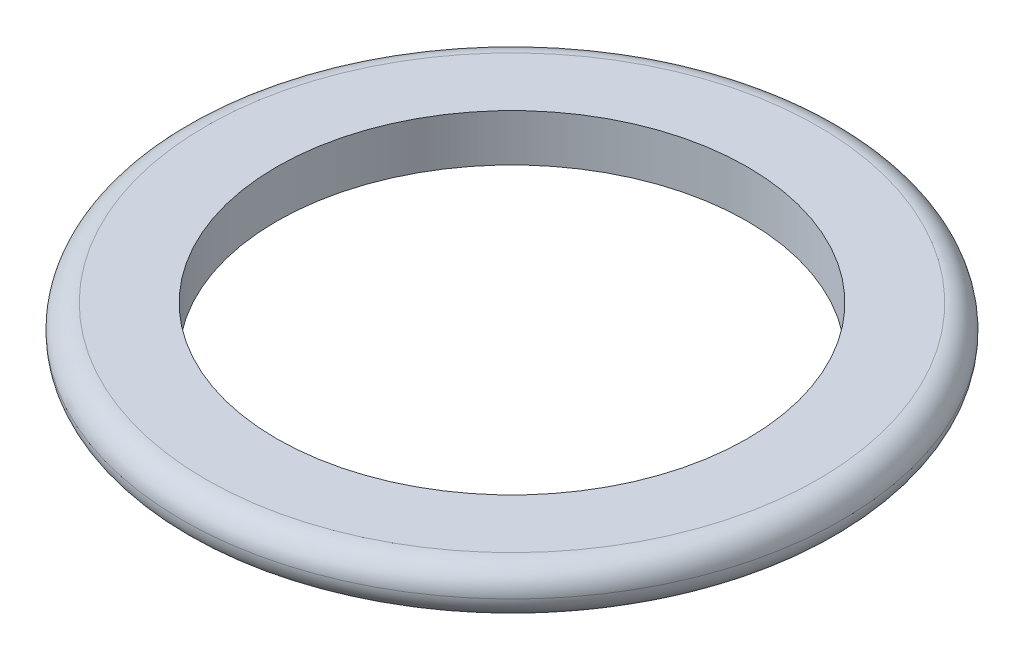
ISO-10303-21;
HEADER;
FILE_DESCRIPTION(('STEP AP214'),'2;1');
FILE_NAME('part.step','',(''),(''),'','','');
FILE_SCHEMA(('AUTOMOTIVE_DESIGN { 1 0 10303 214 1 1 1 1 }'));
ENDSEC;
DATA;
#1=APPLICATION_CONTEXT('core data for automotive mechanical design processes');
#2=APPLICATION_PROTOCOL_DEFINITION('international standard','automotive_design',2000,#1);
#3=PRODUCT_CONTEXT('',#1,'mechanical');
#4=PRODUCT('Part','Part','',(#3));
#5=PRODUCT_RELATED_PRODUCT_CATEGORY('part','',(#4));
#6=PRODUCT_DEFINITION_FORMATION('','',#4);
#7=PRODUCT_DEFINITION_CONTEXT('part definition',#1,'design');
#8=PRODUCT_DEFINITION('design','',#6,#7);
#9=PRODUCT_DEFINITION_SHAPE('','',#8);
#10=(LENGTH_UNIT() NAMED_UNIT(*) SI_UNIT(.MILLI.,.METRE.));
#11=(NAMED_UNIT(*) PLANE_ANGLE_UNIT() SI_UNIT($,.RADIAN.));
#12=(NAMED_UNIT(*) SI_UNIT($,.STERADIAN.) SOLID_ANGLE_UNIT());
#13=UNCERTAINTY_MEASURE_WITH_UNIT(LENGTH_MEASURE(1.E-05),#10,'distance_accuracy_value','');
#14=(GEOMETRIC_REPRESENTATION_CONTEXT(3) GLOBAL_UNCERTAINTY_ASSIGNED_CONTEXT((#13)) GLOBAL_UNIT_ASSIGNED_CONTEXT((#10,
#11,#12)) REPRESENTATION_CONTEXT('',''));
#15=CARTESIAN_POINT('',(0.,0.,0.));
#16=DIRECTION('',(0.,0.,1.));
#17=DIRECTION('',(1.,0.,0.));
#18=AXIS2_PLACEMENT_3D('',#15,#16,#17);
#19=CARTESIAN_POINT('',(0.,1.,0.));
#20=DIRECTION('',(0.,1.,0.));
#21=DIRECTION('',(0.,0.,1.));
#22=AXIS2_PLACEMENT_3D('',#19,#20,#21);
#23=PLANE('',#22);
#24=CARTESIAN_POINT('',(0.,1.,0.));
#25=DIRECTION('',(0.,1.,0.));
#26=DIRECTION('',(0.,0.,1.));
#27=AXIS2_PLACEMENT_3D('',#24,#25,#26);
#28=CIRCLE('',#27,6.5);
#29=CARTESIAN_POINT('',(0.,1.,6.5));
#30=VERTEX_POINT('',#29);
#31=EDGE_CURVE('E10',#30,#30,#28,.T.);
#32=ORIENTED_EDGE('',*,*,#31,.T.);
#33=EDGE_LOOP('',(#32));
#34=FACE_BOUND('',#33,.T.);
#35=CARTESIAN_POINT('',(0.,1.,0.));
#36=DIRECTION('',(0.,1.,0.));
#37=DIRECTION('',(0.,0.,1.));
#38=AXIS2_PLACEMENT_3D('',#35,#36,#37);
#39=CIRCLE('',#38,5.);
#40=CARTESIAN_POINT('',(0.,1.,5.));
#41=VERTEX_POINT('',#40);
#42=EDGE_CURVE('E51',#41,#41,#39,.T.);
#43=ORIENTED_EDGE('',*,*,#42,.F.);
#44=EDGE_LOOP('',(#43));
#45=FACE_BOUND('',#44,.T.);
#46=ADVANCED_FACE('F39',(#34,#45),#23,.T.);
#47=CARTESIAN_POINT('',(0.,0.,0.));
#48=DIRECTION('',(0.,1.,0.));
#49=DIRECTION('',(0.,0.,1.));
#50=AXIS2_PLACEMENT_3D('',#47,#48,#49);
#51=PLANE('',#50);
#52=CARTESIAN_POINT('',(0.,0.,0.));
#53=DIRECTION('',(0.,1.,0.));
#54=DIRECTION('',(0.,0.,1.));
#55=AXIS2_PLACEMENT_3D('',#52,#53,#54);
#56=CIRCLE('',#55,6.5);
#57=CARTESIAN_POINT('',(0.,0.,6.5));
#58=VERTEX_POINT('',#57);
#59=EDGE_CURVE('E50',#58,#58,#56,.F.);
#60=ORIENTED_EDGE('',*,*,#59,.T.);
#61=EDGE_LOOP('',(#60));
#62=FACE_BOUND('',#61,.T.);
#63=CARTESIAN_POINT('',(0.,0.,0.));
#64=DIRECTION('',(0.,1.,0.));
#65=DIRECTION('',(0.,0.,1.));
#66=AXIS2_PLACEMENT_3D('',#63,#64,#65);
#67=CIRCLE('',#66,5.);
#68=CARTESIAN_POINT('',(0.,0.,5.));
#69=VERTEX_POINT('',#68);
#70=EDGE_CURVE('E53',#69,#69,#67,.T.);
#71=ORIENTED_EDGE('',*,*,#70,.T.);
#72=EDGE_LOOP('',(#71));
#73=FACE_BOUND('',#72,.T.);
#74=ADVANCED_FACE('F65',(#62,#73),#51,.F.);
#75=CARTESIAN_POINT('',(0.,1.,0.));
#76=DIRECTION('',(0.,-1.,0.));
#77=DIRECTION('',(0.,0.,-1.));
#78=AXIS2_PLACEMENT_3D('',#75,#76,#77);
#79=CYLINDRICAL_SURFACE('',#78,5.);
#80=ORIENTED_EDGE('',*,*,#42,.T.);
#81=EDGE_LOOP('',(#80));
#82=FACE_BOUND('',#81,.T.);
#83=ORIENTED_EDGE('',*,*,#70,.F.);
#84=EDGE_LOOP('',(#83));
#85=FACE_BOUND('',#84,.T.);
#86=ADVANCED_FACE('F58',(#82,#85),#79,.F.);
#87=CARTESIAN_POINT('',(0.,0.5,0.));
#88=DIRECTION('',(0.,1.,0.));
#89=DIRECTION('',(0.,0.,1.));
#90=AXIS2_PLACEMENT_3D('',#87,#88,#89);
#91=TOROIDAL_SURFACE('',#90,6.5,0.5);
#92=ORIENTED_EDGE('',*,*,#31,.F.);
#93=EDGE_LOOP('',(#92));
#94=FACE_BOUND('',#93,.T.);
#95=CARTESIAN_POINT('',(0.,0.5,0.));
#96=DIRECTION('',(0.,1.,0.));
#97=DIRECTION('',(0.,0.,1.));
#98=AXIS2_PLACEMENT_3D('',#95,#96,#97);
#99=CIRCLE('',#98,7.);
#100=CARTESIAN_POINT('',(0.,0.5,7.));
#101=VERTEX_POINT('',#100);
#102=EDGE_CURVE('E43',#101,#101,#99,.F.);
#103=ORIENTED_EDGE('',*,*,#102,.F.);
#104=EDGE_LOOP('',(#103));
#105=FACE_BOUND('',#104,.T.);
#106=ADVANCED_FACE('F41',(#94,#105),#91,.T.);
#107=CARTESIAN_POINT('',(0.,0.5,0.));
#108=DIRECTION('',(0.,1.,0.));
#109=DIRECTION('',(0.,0.,1.));
#110=AXIS2_PLACEMENT_3D('',#107,#108,#109);
#111=TOROIDAL_SURFACE('',#110,6.5,0.5);
#112=ORIENTED_EDGE('',*,*,#59,.F.);
#113=EDGE_LOOP('',(#112));
#114=FACE_BOUND('',#113,.T.);
#115=ORIENTED_EDGE('',*,*,#102,.T.);
#116=EDGE_LOOP('',(#115));
#117=FACE_BOUND('',#116,.T.);
#118=ADVANCED_FACE('F71',(#114,#117),#111,.T.);
#119=CLOSED_SHELL('',(#46,#74,#86,#106,#118));
#120=MANIFOLD_SOLID_BREP('B2',#119);
#121=ADVANCED_BREP_SHAPE_REPRESENTATION('',(#18,#120),#14);
#122=SHAPE_DEFINITION_REPRESENTATION(#9,#121);
ENDSEC;
END-ISO-10303-21;
